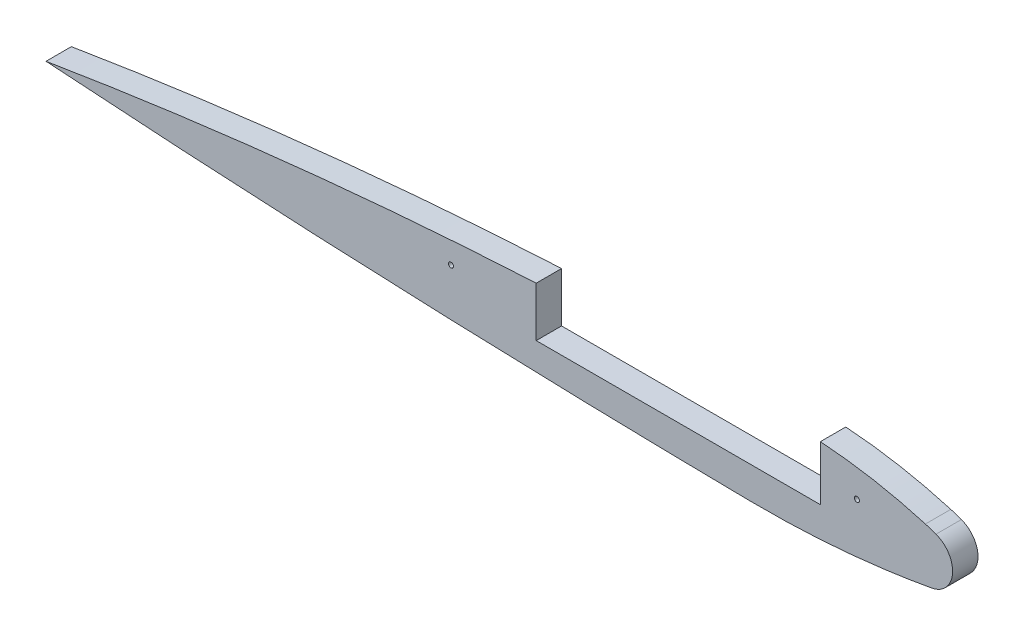
ISO-10303-21;
HEADER;
FILE_DESCRIPTION(('STEP AP214'),'2;1');
FILE_NAME('part.step','',(''),(''),'','','');
FILE_SCHEMA(('AUTOMOTIVE_DESIGN { 1 0 10303 214 1 1 1 1 }'));
ENDSEC;
DATA;
#1=APPLICATION_CONTEXT('core data for automotive mechanical design processes');
#2=APPLICATION_PROTOCOL_DEFINITION('international standard','automotive_design',2000,#1);
#3=PRODUCT_CONTEXT('',#1,'mechanical');
#4=PRODUCT('Part','Part','',(#3));
#5=PRODUCT_RELATED_PRODUCT_CATEGORY('part','',(#4));
#6=PRODUCT_DEFINITION_FORMATION('','',#4);
#7=PRODUCT_DEFINITION_CONTEXT('part definition',#1,'design');
#8=PRODUCT_DEFINITION('design','',#6,#7);
#9=PRODUCT_DEFINITION_SHAPE('','',#8);
#10=(LENGTH_UNIT() NAMED_UNIT(*) SI_UNIT(.MILLI.,.METRE.));
#11=(NAMED_UNIT(*) PLANE_ANGLE_UNIT() SI_UNIT($,.RADIAN.));
#12=(NAMED_UNIT(*) SI_UNIT($,.STERADIAN.) SOLID_ANGLE_UNIT());
#13=UNCERTAINTY_MEASURE_WITH_UNIT(LENGTH_MEASURE(1.E-05),#10,'distance_accuracy_value','');
#14=(GEOMETRIC_REPRESENTATION_CONTEXT(3) GLOBAL_UNCERTAINTY_ASSIGNED_CONTEXT((#13)) GLOBAL_UNIT_ASSIGNED_CONTEXT((#10,
#11,#12)) REPRESENTATION_CONTEXT('',''));
#15=CARTESIAN_POINT('',(0.,0.,0.));
#16=DIRECTION('',(0.,0.,1.));
#17=DIRECTION('',(1.,0.,0.));
#18=AXIS2_PLACEMENT_3D('',#15,#16,#17);
#19=CARTESIAN_POINT('',(36.2563303026578,-106.311961463395,6.35));
#20=DIRECTION('',(0.,0.,1.));
#21=DIRECTION('',(1.,0.,0.));
#22=AXIS2_PLACEMENT_3D('',#19,#20,#21);
#23=PLANE('',#22);
#24=CARTESIAN_POINT('',(-102.943690277273,19.812,6.35));
#25=DIRECTION('',(0.,0.,1.));
#26=DIRECTION('',(1.,0.,0.));
#27=AXIS2_PLACEMENT_3D('',#24,#25,#26);
#28=CIRCLE('',#27,0.635000000000002);
#29=CARTESIAN_POINT('',(-102.308690277273,19.812,6.35));
#30=VERTEX_POINT('',#29);
#31=EDGE_CURVE('E282',#30,#30,#28,.T.);
#32=ORIENTED_EDGE('',*,*,#31,.F.);
#33=EDGE_LOOP('',(#32));
#34=FACE_BOUND('',#33,.T.);
#35=CARTESIAN_POINT('',(-1.34369027727303,19.812,6.35));
#36=DIRECTION('',(0.,0.,1.));
#37=DIRECTION('',(1.,0.,0.));
#38=AXIS2_PLACEMENT_3D('',#35,#36,#37);
#39=CIRCLE('',#38,0.634999999999998);
#40=CARTESIAN_POINT('',(-0.708690277273036,19.812,6.35));
#41=VERTEX_POINT('',#40);
#42=EDGE_CURVE('E232',#41,#41,#39,.T.);
#43=ORIENTED_EDGE('',*,*,#42,.F.);
#44=EDGE_LOOP('',(#43));
#45=FACE_BOUND('',#44,.T.);
#46=DIRECTION('',(0.,1.,0.));
#47=VECTOR('',#46,1.);
#48=CARTESIAN_POINT('',(-81.607690277273,25.527,6.35));
#49=LINE('',#48,#47);
#50=CARTESIAN_POINT('',(-81.607690277273,14.097,6.35));
#51=VERTEX_POINT('',#50);
#52=CARTESIAN_POINT('',(-81.6076902772731,26.5483149903039,6.35));
#53=VERTEX_POINT('',#52);
#54=EDGE_CURVE('E114',#51,#53,#49,.T.);
#55=ORIENTED_EDGE('',*,*,#54,.T.);
#56=CARTESIAN_POINT('',(-23.5090756810409,-930.341693913225,6.35));
#57=DIRECTION('',(0.,0.,1.));
#58=DIRECTION('',(1.,0.,0.));
#59=AXIS2_PLACEMENT_3D('',#56,#57,#58);
#60=ELLIPSE('',#59,1033.67315590804,958.405061057029);
#61=CARTESIAN_POINT('',(-204.294256369334,13.2914062198968,6.35));
#62=VERTEX_POINT('',#61);
#63=EDGE_CURVE('E117',#53,#62,#60,.T.);
#64=ORIENTED_EDGE('',*,*,#63,.T.);
#65=CARTESIAN_POINT('',(3.97070538947494,2195.69893856267,6.35));
#66=DIRECTION('',(0.,0.,1.));
#67=DIRECTION('',(0.999969321883776,-0.00783296184731889,0.));
#68=AXIS2_PLACEMENT_3D('',#65,#66,#67);
#69=ELLIPSE('',#68,2616.55390755447,2189.82401671418);
#70=CARTESIAN_POINT('',(-28.2927042476808,6.09698698342909,6.35));
#71=VERTEX_POINT('',#70);
#72=EDGE_CURVE('E135',#62,#71,#69,.T.);
#73=ORIENTED_EDGE('',*,*,#72,.T.);
#74=CARTESIAN_POINT('',(-25.2914630612763,209.779210174929,6.35));
#75=DIRECTION('',(0.,0.,1.));
#76=DIRECTION('',(1.,0.,0.));
#77=AXIS2_PLACEMENT_3D('',#74,#75,#76);
#78=ELLIPSE('',#77,219.69885466917,203.701230916069);
#79=CARTESIAN_POINT('',(17.4084463771385,9.96236755878013,6.35));
#80=VERTEX_POINT('',#79);
#81=EDGE_CURVE('E142',#71,#80,#78,.T.);
#82=ORIENTED_EDGE('',*,*,#81,.T.);
#83=CARTESIAN_POINT('',(16.2611044000867,16.2078544403366,6.35));
#84=DIRECTION('',(0.,0.,1.));
#85=DIRECTION('',(1.,0.,0.));
#86=AXIS2_PLACEMENT_3D('',#83,#84,#85);
#87=CIRCLE('',#86,6.35);
#88=CARTESIAN_POINT('',(18.4537211022759,22.1672950178809,6.35));
#89=VERTEX_POINT('',#88);
#90=EDGE_CURVE('E12',#80,#89,#87,.T.);
#91=ORIENTED_EDGE('',*,*,#90,.T.);
#92=CARTESIAN_POINT('',(3.66991363984412,-12.3757639930228,6.35));
#93=DIRECTION('',(0.,0.,1.));
#94=DIRECTION('',(1.,0.,0.));
#95=AXIS2_PLACEMENT_3D('',#92,#93,#94);
#96=ELLIPSE('',#95,40.081944161436,37.1633314861309);
#97=CARTESIAN_POINT('',(15.7959364600178,23.0460792093641,6.35));
#98=VERTEX_POINT('',#97);
#99=EDGE_CURVE('E265',#89,#98,#96,.T.);
#100=ORIENTED_EDGE('',*,*,#99,.T.);
#101=CARTESIAN_POINT('',(-19.0703046319003,-78.8031868962383,6.35));
#102=DIRECTION('',(0.,0.,1.));
#103=DIRECTION('',(1.,0.,0.));
#104=AXIS2_PLACEMENT_3D('',#101,#102,#103);
#105=ELLIPSE('',#104,115.248564949124,106.85660868282);
#106=CARTESIAN_POINT('',(-10.487690277273,27.7567044479627,6.35));
#107=VERTEX_POINT('',#106);
#108=EDGE_CURVE('E136',#98,#107,#105,.T.);
#109=ORIENTED_EDGE('',*,*,#108,.T.);
#110=DIRECTION('',(0.,-1.,0.));
#111=VECTOR('',#110,1.);
#112=CARTESIAN_POINT('',(-10.487690277273,25.527,6.35));
#113=LINE('',#112,#111);
#114=CARTESIAN_POINT('',(-10.487690277273,14.097,6.35));
#115=VERTEX_POINT('',#114);
#116=EDGE_CURVE('E58',#107,#115,#113,.T.);
#117=ORIENTED_EDGE('',*,*,#116,.T.);
#118=DIRECTION('',(-1.,0.,0.));
#119=VECTOR('',#118,1.);
#120=CARTESIAN_POINT('',(-10.487690277273,14.097,6.35));
#121=LINE('',#120,#119);
#122=EDGE_CURVE('E120',#115,#51,#121,.T.);
#123=ORIENTED_EDGE('',*,*,#122,.T.);
#124=EDGE_LOOP('',(#55,#64,#73,#82,#91,#100,#109,#117,#123));
#125=FACE_BOUND('',#124,.T.);
#126=ADVANCED_FACE('F40',(#34,#45,#125),#23,.T.);
#127=CARTESIAN_POINT('',(36.2563303026578,-106.311961463395,0.));
#128=DIRECTION('',(0.,0.,1.));
#129=DIRECTION('',(1.,0.,0.));
#130=AXIS2_PLACEMENT_3D('',#127,#128,#129);
#131=PLANE('',#130);
#132=CARTESIAN_POINT('',(-102.943690277273,19.812,0.));
#133=DIRECTION('',(0.,0.,1.));
#134=DIRECTION('',(1.,0.,0.));
#135=AXIS2_PLACEMENT_3D('',#132,#133,#134);
#136=CIRCLE('',#135,0.635000000000002);
#137=CARTESIAN_POINT('',(-102.308690277273,19.812,0.));
#138=VERTEX_POINT('',#137);
#139=EDGE_CURVE('E198',#138,#138,#136,.T.);
#140=ORIENTED_EDGE('',*,*,#139,.T.);
#141=EDGE_LOOP('',(#140));
#142=FACE_BOUND('',#141,.T.);
#143=CARTESIAN_POINT('',(-1.34369027727303,19.812,0.));
#144=DIRECTION('',(0.,0.,1.));
#145=DIRECTION('',(1.,0.,0.));
#146=AXIS2_PLACEMENT_3D('',#143,#144,#145);
#147=CIRCLE('',#146,0.634999999999998);
#148=CARTESIAN_POINT('',(-0.708690277273036,19.812,0.));
#149=VERTEX_POINT('',#148);
#150=EDGE_CURVE('E202',#149,#149,#147,.T.);
#151=ORIENTED_EDGE('',*,*,#150,.T.);
#152=EDGE_LOOP('',(#151));
#153=FACE_BOUND('',#152,.T.);
#154=CARTESIAN_POINT('',(-23.5090756810409,-930.341693913225,0.));
#155=DIRECTION('',(0.,0.,1.));
#156=DIRECTION('',(1.,0.,0.));
#157=AXIS2_PLACEMENT_3D('',#154,#155,#156);
#158=ELLIPSE('',#157,1033.67315590804,958.405061057029);
#159=CARTESIAN_POINT('',(-81.6076902772731,26.5483149903039,0.));
#160=VERTEX_POINT('',#159);
#161=CARTESIAN_POINT('',(-204.294256369334,13.2914062198968,0.));
#162=VERTEX_POINT('',#161);
#163=EDGE_CURVE('E151',#160,#162,#158,.T.);
#164=ORIENTED_EDGE('',*,*,#163,.F.);
#165=DIRECTION('',(0.,1.,0.));
#166=VECTOR('',#165,1.);
#167=CARTESIAN_POINT('',(-81.607690277273,25.527,0.));
#168=LINE('',#167,#166);
#169=CARTESIAN_POINT('',(-81.607690277273,14.097,0.));
#170=VERTEX_POINT('',#169);
#171=EDGE_CURVE('E66',#170,#160,#168,.T.);
#172=ORIENTED_EDGE('',*,*,#171,.F.);
#173=DIRECTION('',(-1.,0.,0.));
#174=VECTOR('',#173,1.);
#175=CARTESIAN_POINT('',(-10.487690277273,14.097,0.));
#176=LINE('',#175,#174);
#177=CARTESIAN_POINT('',(-10.487690277273,14.097,0.));
#178=VERTEX_POINT('',#177);
#179=EDGE_CURVE('E224',#178,#170,#176,.T.);
#180=ORIENTED_EDGE('',*,*,#179,.F.);
#181=DIRECTION('',(0.,-1.,0.));
#182=VECTOR('',#181,1.);
#183=CARTESIAN_POINT('',(-10.487690277273,25.527,0.));
#184=LINE('',#183,#182);
#185=CARTESIAN_POINT('',(-10.487690277273,27.7567044479627,0.));
#186=VERTEX_POINT('',#185);
#187=EDGE_CURVE('E229',#186,#178,#184,.T.);
#188=ORIENTED_EDGE('',*,*,#187,.F.);
#189=CARTESIAN_POINT('',(-19.0703046319003,-78.8031868962383,0.));
#190=DIRECTION('',(0.,0.,1.));
#191=DIRECTION('',(1.,0.,0.));
#192=AXIS2_PLACEMENT_3D('',#189,#190,#191);
#193=ELLIPSE('',#192,115.248564949124,106.85660868282);
#194=CARTESIAN_POINT('',(15.7959364600178,23.0460792093641,0.));
#195=VERTEX_POINT('',#194);
#196=EDGE_CURVE('E153',#195,#186,#193,.T.);
#197=ORIENTED_EDGE('',*,*,#196,.F.);
#198=CARTESIAN_POINT('',(3.66991363984412,-12.3757639930228,0.));
#199=DIRECTION('',(0.,0.,1.));
#200=DIRECTION('',(1.,0.,0.));
#201=AXIS2_PLACEMENT_3D('',#198,#199,#200);
#202=ELLIPSE('',#201,40.081944161436,37.1633314861309);
#203=CARTESIAN_POINT('',(18.4537211022759,22.1672950178809,0.));
#204=VERTEX_POINT('',#203);
#205=EDGE_CURVE('E146',#204,#195,#202,.T.);
#206=ORIENTED_EDGE('',*,*,#205,.F.);
#207=CARTESIAN_POINT('',(16.2611044000867,16.2078544403366,0.));
#208=DIRECTION('',(0.,0.,1.));
#209=DIRECTION('',(1.,0.,0.));
#210=AXIS2_PLACEMENT_3D('',#207,#208,#209);
#211=CIRCLE('',#210,6.35);
#212=CARTESIAN_POINT('',(17.4084463771385,9.96236755878013,0.));
#213=VERTEX_POINT('',#212);
#214=EDGE_CURVE('E253',#204,#213,#211,.F.);
#215=ORIENTED_EDGE('',*,*,#214,.T.);
#216=CARTESIAN_POINT('',(-25.2914630612763,209.779210174929,0.));
#217=DIRECTION('',(0.,0.,1.));
#218=DIRECTION('',(1.,0.,0.));
#219=AXIS2_PLACEMENT_3D('',#216,#217,#218);
#220=ELLIPSE('',#219,219.69885466917,203.701230916069);
#221=CARTESIAN_POINT('',(-28.2927042476808,6.09698698342909,0.));
#222=VERTEX_POINT('',#221);
#223=EDGE_CURVE('E211',#222,#213,#220,.T.);
#224=ORIENTED_EDGE('',*,*,#223,.F.);
#225=CARTESIAN_POINT('',(3.97070538947494,2195.69893856267,0.));
#226=DIRECTION('',(0.,0.,1.));
#227=DIRECTION('',(0.999969321883776,-0.00783296184731889,0.));
#228=AXIS2_PLACEMENT_3D('',#225,#226,#227);
#229=ELLIPSE('',#228,2616.55390755447,2189.82401671418);
#230=EDGE_CURVE('E207',#162,#222,#229,.T.);
#231=ORIENTED_EDGE('',*,*,#230,.F.);
#232=EDGE_LOOP('',(#164,#172,#180,#188,#197,#206,#215,#224,#231));
#233=FACE_BOUND('',#232,.T.);
#234=ADVANCED_FACE('F171',(#142,#153,#233),#131,.F.);
#235=DIRECTION('',(0.,0.,-1.));
#236=VECTOR('',#235,1.);
#237=SURFACE_OF_LINEAR_EXTRUSION('',#105,#236);
#238=DIRECTION('',(0.,0.,-1.));
#239=VECTOR('',#238,1.);
#240=CARTESIAN_POINT('',(-10.487690277273,27.7567044479627,6.35));
#241=LINE('',#240,#239);
#242=EDGE_CURVE('E128',#107,#186,#241,.T.);
#243=ORIENTED_EDGE('',*,*,#242,.F.);
#244=ORIENTED_EDGE('',*,*,#108,.F.);
#245=DIRECTION('',(0.,0.,-1.));
#246=VECTOR('',#245,1.);
#247=CARTESIAN_POINT('',(15.7959364600178,23.0460792093641,6.35));
#248=LINE('',#247,#246);
#249=EDGE_CURVE('E276',#98,#195,#248,.T.);
#250=ORIENTED_EDGE('',*,*,#249,.T.);
#251=ORIENTED_EDGE('',*,*,#196,.T.);
#252=EDGE_LOOP('',(#243,#244,#250,#251));
#253=FACE_BOUND('',#252,.T.);
#254=ADVANCED_FACE('F166',(#253),#237,.F.);
#255=DIRECTION('',(0.,0.,-1.));
#256=VECTOR('',#255,1.);
#257=SURFACE_OF_LINEAR_EXTRUSION('',#60,#256);
#258=DIRECTION('',(0.,0.,-1.));
#259=VECTOR('',#258,1.);
#260=CARTESIAN_POINT('',(-81.6076902772731,26.5483149903039,6.35));
#261=LINE('',#260,#259);
#262=EDGE_CURVE('E124',#53,#160,#261,.T.);
#263=ORIENTED_EDGE('',*,*,#262,.T.);
#264=ORIENTED_EDGE('',*,*,#163,.T.);
#265=DIRECTION('',(0.,0.,-1.));
#266=VECTOR('',#265,1.);
#267=CARTESIAN_POINT('',(-204.294256369334,13.2914062198968,6.35));
#268=LINE('',#267,#266);
#269=EDGE_CURVE('E132',#62,#162,#268,.T.);
#270=ORIENTED_EDGE('',*,*,#269,.F.);
#271=ORIENTED_EDGE('',*,*,#63,.F.);
#272=EDGE_LOOP('',(#263,#264,#270,#271));
#273=FACE_BOUND('',#272,.T.);
#274=ADVANCED_FACE('F130',(#273),#257,.F.);
#275=CARTESIAN_POINT('',(-10.487690277273,25.527,6.35));
#276=DIRECTION('',(1.,0.,0.));
#277=DIRECTION('',(0.,0.,-1.));
#278=AXIS2_PLACEMENT_3D('',#275,#276,#277);
#279=PLANE('',#278);
#280=ORIENTED_EDGE('',*,*,#187,.T.);
#281=DIRECTION('',(0.,0.,-1.));
#282=VECTOR('',#281,1.);
#283=CARTESIAN_POINT('',(-10.487690277273,14.097,6.35));
#284=LINE('',#283,#282);
#285=EDGE_CURVE('E122',#115,#178,#284,.T.);
#286=ORIENTED_EDGE('',*,*,#285,.F.);
#287=ORIENTED_EDGE('',*,*,#116,.F.);
#288=ORIENTED_EDGE('',*,*,#242,.T.);
#289=EDGE_LOOP('',(#280,#286,#287,#288));
#290=FACE_BOUND('',#289,.T.);
#291=ADVANCED_FACE('F165',(#290),#279,.F.);
#292=CARTESIAN_POINT('',(-81.607690277273,25.527,6.35));
#293=DIRECTION('',(-1.,0.,0.));
#294=DIRECTION('',(0.,0.,1.));
#295=AXIS2_PLACEMENT_3D('',#292,#293,#294);
#296=PLANE('',#295);
#297=ORIENTED_EDGE('',*,*,#171,.T.);
#298=ORIENTED_EDGE('',*,*,#262,.F.);
#299=ORIENTED_EDGE('',*,*,#54,.F.);
#300=DIRECTION('',(0.,0.,-1.));
#301=VECTOR('',#300,1.);
#302=CARTESIAN_POINT('',(-81.607690277273,14.097,6.35));
#303=LINE('',#302,#301);
#304=EDGE_CURVE('E245',#51,#170,#303,.T.);
#305=ORIENTED_EDGE('',*,*,#304,.T.);
#306=EDGE_LOOP('',(#297,#298,#299,#305));
#307=FACE_BOUND('',#306,.T.);
#308=ADVANCED_FACE('F125',(#307),#296,.F.);
#309=CARTESIAN_POINT('',(-10.487690277273,14.097,6.35));
#310=DIRECTION('',(0.,-1.,0.));
#311=DIRECTION('',(0.,0.,-1.));
#312=AXIS2_PLACEMENT_3D('',#309,#310,#311);
#313=PLANE('',#312);
#314=ORIENTED_EDGE('',*,*,#179,.T.);
#315=ORIENTED_EDGE('',*,*,#304,.F.);
#316=ORIENTED_EDGE('',*,*,#122,.F.);
#317=ORIENTED_EDGE('',*,*,#285,.T.);
#318=EDGE_LOOP('',(#314,#315,#316,#317));
#319=FACE_BOUND('',#318,.T.);
#320=ADVANCED_FACE('F180',(#319),#313,.F.);
#321=CARTESIAN_POINT('',(-1.34369027727303,19.812,6.35));
#322=DIRECTION('',(0.,0.,-1.));
#323=DIRECTION('',(-1.,0.,0.));
#324=AXIS2_PLACEMENT_3D('',#321,#322,#323);
#325=CYLINDRICAL_SURFACE('',#324,0.634999999999998);
#326=ORIENTED_EDGE('',*,*,#42,.T.);
#327=EDGE_LOOP('',(#326));
#328=FACE_BOUND('',#327,.T.);
#329=ORIENTED_EDGE('',*,*,#150,.F.);
#330=EDGE_LOOP('',(#329));
#331=FACE_BOUND('',#330,.T.);
#332=ADVANCED_FACE('F176',(#328,#331),#325,.F.);
#333=CARTESIAN_POINT('',(-102.943690277273,19.812,6.35));
#334=DIRECTION('',(0.,0.,-1.));
#335=DIRECTION('',(-1.,0.,0.));
#336=AXIS2_PLACEMENT_3D('',#333,#334,#335);
#337=CYLINDRICAL_SURFACE('',#336,0.635000000000002);
#338=ORIENTED_EDGE('',*,*,#31,.T.);
#339=EDGE_LOOP('',(#338));
#340=FACE_BOUND('',#339,.T.);
#341=ORIENTED_EDGE('',*,*,#139,.F.);
#342=EDGE_LOOP('',(#341));
#343=FACE_BOUND('',#342,.T.);
#344=ADVANCED_FACE('F173',(#340,#343),#337,.F.);
#345=DIRECTION('',(0.,0.,-1.));
#346=VECTOR('',#345,1.);
#347=SURFACE_OF_LINEAR_EXTRUSION('',#69,#346);
#348=ORIENTED_EDGE('',*,*,#230,.T.);
#349=DIRECTION('',(0.,0.,-1.));
#350=VECTOR('',#349,1.);
#351=CARTESIAN_POINT('',(-28.2927042476808,6.09698698342909,6.35));
#352=LINE('',#351,#350);
#353=EDGE_CURVE('E278',#71,#222,#352,.T.);
#354=ORIENTED_EDGE('',*,*,#353,.F.);
#355=ORIENTED_EDGE('',*,*,#72,.F.);
#356=ORIENTED_EDGE('',*,*,#269,.T.);
#357=EDGE_LOOP('',(#348,#354,#355,#356));
#358=FACE_BOUND('',#357,.T.);
#359=ADVANCED_FACE('F167',(#358),#347,.F.);
#360=DIRECTION('',(0.,0.,-1.));
#361=VECTOR('',#360,1.);
#362=SURFACE_OF_LINEAR_EXTRUSION('',#78,#361);
#363=ORIENTED_EDGE('',*,*,#223,.T.);
#364=DIRECTION('',(0.,0.,-1.));
#365=VECTOR('',#364,1.);
#366=CARTESIAN_POINT('',(17.4084463771385,9.96236755878013,0.));
#367=LINE('',#366,#365);
#368=EDGE_CURVE('E50',#213,#80,#367,.F.);
#369=ORIENTED_EDGE('',*,*,#368,.T.);
#370=ORIENTED_EDGE('',*,*,#81,.F.);
#371=ORIENTED_EDGE('',*,*,#353,.T.);
#372=EDGE_LOOP('',(#363,#369,#370,#371));
#373=FACE_BOUND('',#372,.T.);
#374=ADVANCED_FACE('F261',(#373),#362,.F.);
#375=DIRECTION('',(0.,0.,-1.));
#376=VECTOR('',#375,1.);
#377=SURFACE_OF_LINEAR_EXTRUSION('',#96,#376);
#378=ORIENTED_EDGE('',*,*,#99,.F.);
#379=DIRECTION('',(0.,0.,-1.));
#380=VECTOR('',#379,1.);
#381=CARTESIAN_POINT('',(18.4537211022759,22.1672950178809,6.35));
#382=LINE('',#381,#380);
#383=EDGE_CURVE('E247',#89,#204,#382,.T.);
#384=ORIENTED_EDGE('',*,*,#383,.T.);
#385=ORIENTED_EDGE('',*,*,#205,.T.);
#386=ORIENTED_EDGE('',*,*,#249,.F.);
#387=EDGE_LOOP('',(#378,#384,#385,#386));
#388=FACE_BOUND('',#387,.T.);
#389=ADVANCED_FACE('F269',(#388),#377,.F.);
#390=CARTESIAN_POINT('',(16.2611044000867,16.2078544403366,3.175));
#391=DIRECTION('',(0.,0.,-1.));
#392=DIRECTION('',(-1.,0.,0.));
#393=AXIS2_PLACEMENT_3D('',#390,#391,#392);
#394=CYLINDRICAL_SURFACE('',#393,6.35);
#395=ORIENTED_EDGE('',*,*,#90,.F.);
#396=ORIENTED_EDGE('',*,*,#368,.F.);
#397=ORIENTED_EDGE('',*,*,#214,.F.);
#398=ORIENTED_EDGE('',*,*,#383,.F.);
#399=EDGE_LOOP('',(#395,#396,#397,#398));
#400=FACE_BOUND('',#399,.T.);
#401=ADVANCED_FACE('F42',(#400),#394,.T.);
#402=CLOSED_SHELL('',(#126,#234,#254,#274,#291,#308,#320,#332,#344,#359,#374,#389,#401));
#403=MANIFOLD_SOLID_BREP('B2',#402);
#404=ADVANCED_BREP_SHAPE_REPRESENTATION('',(#18,#403),#14);
#405=SHAPE_DEFINITION_REPRESENTATION(#9,#404);
ENDSEC;
END-ISO-10303-21;
